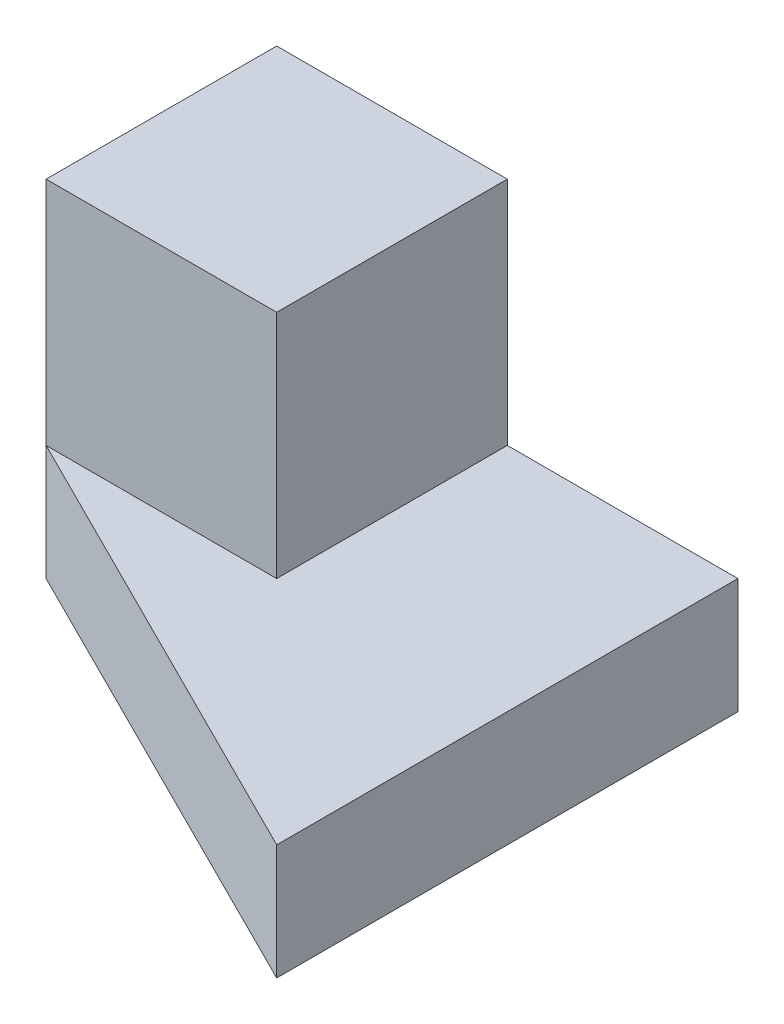
ISO-10303-21;
HEADER;
FILE_DESCRIPTION(('STEP AP214'),'2;1');
FILE_NAME('part.step','',(''),(''),'','','');
FILE_SCHEMA(('AUTOMOTIVE_DESIGN { 1 0 10303 214 1 1 1 1 }'));
ENDSEC;
DATA;
#1=APPLICATION_CONTEXT('core data for automotive mechanical design processes');
#2=APPLICATION_PROTOCOL_DEFINITION('international standard','automotive_design',2000,#1);
#3=PRODUCT_CONTEXT('',#1,'mechanical');
#4=PRODUCT('Part','Part','',(#3));
#5=PRODUCT_RELATED_PRODUCT_CATEGORY('part','',(#4));
#6=PRODUCT_DEFINITION_FORMATION('','',#4);
#7=PRODUCT_DEFINITION_CONTEXT('part definition',#1,'design');
#8=PRODUCT_DEFINITION('design','',#6,#7);
#9=PRODUCT_DEFINITION_SHAPE('','',#8);
#10=(LENGTH_UNIT() NAMED_UNIT(*) SI_UNIT(.MILLI.,.METRE.));
#11=(NAMED_UNIT(*) PLANE_ANGLE_UNIT() SI_UNIT($,.RADIAN.));
#12=(NAMED_UNIT(*) SI_UNIT($,.STERADIAN.) SOLID_ANGLE_UNIT());
#13=UNCERTAINTY_MEASURE_WITH_UNIT(LENGTH_MEASURE(1.E-05),#10,'distance_accuracy_value','');
#14=(GEOMETRIC_REPRESENTATION_CONTEXT(3) GLOBAL_UNCERTAINTY_ASSIGNED_CONTEXT((#13)) GLOBAL_UNIT_ASSIGNED_CONTEXT((#10,
#11,#12)) REPRESENTATION_CONTEXT('',''));
#15=CARTESIAN_POINT('',(0.,0.,0.));
#16=DIRECTION('',(0.,0.,1.));
#17=DIRECTION('',(1.,0.,0.));
#18=AXIS2_PLACEMENT_3D('',#15,#16,#17);
#19=CARTESIAN_POINT('',(0.,-10.,0.));
#20=DIRECTION('',(1.,0.,0.));
#21=DIRECTION('',(0.,0.,-1.));
#22=AXIS2_PLACEMENT_3D('',#19,#20,#21);
#23=PLANE('',#22);
#24=DIRECTION('',(0.,1.,0.));
#25=VECTOR('',#24,1.);
#26=CARTESIAN_POINT('',(0.,-10.,0.));
#27=LINE('',#26,#25);
#28=CARTESIAN_POINT('',(0.,-10.,0.));
#29=VERTEX_POINT('',#28);
#30=CARTESIAN_POINT('',(0.,0.,0.));
#31=VERTEX_POINT('',#30);
#32=EDGE_CURVE('E36',#29,#31,#27,.T.);
#33=ORIENTED_EDGE('',*,*,#32,.T.);
#34=DIRECTION('',(0.,-1.,0.));
#35=VECTOR('',#34,1.);
#36=CARTESIAN_POINT('',(0.,20.,0.));
#37=LINE('',#36,#35);
#38=CARTESIAN_POINT('',(0.,20.,0.));
#39=VERTEX_POINT('',#38);
#40=EDGE_CURVE('E123',#39,#31,#37,.T.);
#41=ORIENTED_EDGE('',*,*,#40,.F.);
#42=DIRECTION('',(0.,0.,-1.));
#43=VECTOR('',#42,1.);
#44=CARTESIAN_POINT('',(0.,20.,0.));
#45=LINE('',#44,#43);
#46=CARTESIAN_POINT('',(0.,20.,-20.));
#47=VERTEX_POINT('',#46);
#48=EDGE_CURVE('E112',#39,#47,#45,.T.);
#49=ORIENTED_EDGE('',*,*,#48,.T.);
#50=DIRECTION('',(0.,1.,0.));
#51=VECTOR('',#50,1.);
#52=CARTESIAN_POINT('',(0.,-10.,-20.));
#53=LINE('',#52,#51);
#54=CARTESIAN_POINT('',(0.,-10.,-20.));
#55=VERTEX_POINT('',#54);
#56=EDGE_CURVE('E11',#55,#47,#53,.T.);
#57=ORIENTED_EDGE('',*,*,#56,.F.);
#58=DIRECTION('',(0.,0.,-1.));
#59=VECTOR('',#58,1.);
#60=CARTESIAN_POINT('',(0.,-10.,0.));
#61=LINE('',#60,#59);
#62=EDGE_CURVE('E127',#29,#55,#61,.T.);
#63=ORIENTED_EDGE('',*,*,#62,.F.);
#64=EDGE_LOOP('',(#33,#41,#49,#57,#63));
#65=FACE_BOUND('',#64,.T.);
#66=ADVANCED_FACE('F33',(#65),#23,.F.);
#67=CARTESIAN_POINT('',(0.,-10.,-20.));
#68=DIRECTION('',(0.,0.,1.));
#69=DIRECTION('',(1.,0.,0.));
#70=AXIS2_PLACEMENT_3D('',#67,#68,#69);
#71=PLANE('',#70);
#72=ORIENTED_EDGE('',*,*,#56,.T.);
#73=DIRECTION('',(1.,0.,0.));
#74=VECTOR('',#73,1.);
#75=CARTESIAN_POINT('',(0.,20.,-20.));
#76=LINE('',#75,#74);
#77=CARTESIAN_POINT('',(20.,20.,-20.));
#78=VERTEX_POINT('',#77);
#79=EDGE_CURVE('E105',#47,#78,#76,.T.);
#80=ORIENTED_EDGE('',*,*,#79,.T.);
#81=DIRECTION('',(0.,-1.,0.));
#82=VECTOR('',#81,1.);
#83=CARTESIAN_POINT('',(20.,20.,-20.));
#84=LINE('',#83,#82);
#85=CARTESIAN_POINT('',(20.,0.,-20.));
#86=VERTEX_POINT('',#85);
#87=EDGE_CURVE('E101',#78,#86,#84,.T.);
#88=ORIENTED_EDGE('',*,*,#87,.T.);
#89=DIRECTION('',(1.,0.,0.));
#90=VECTOR('',#89,1.);
#91=CARTESIAN_POINT('',(0.,0.,-20.));
#92=LINE('',#91,#90);
#93=CARTESIAN_POINT('',(40.,0.,-20.));
#94=VERTEX_POINT('',#93);
#95=EDGE_CURVE('E72',#86,#94,#92,.T.);
#96=ORIENTED_EDGE('',*,*,#95,.T.);
#97=DIRECTION('',(0.,1.,0.));
#98=VECTOR('',#97,1.);
#99=CARTESIAN_POINT('',(40.,-10.,-20.));
#100=LINE('',#99,#98);
#101=CARTESIAN_POINT('',(40.,-10.,-20.));
#102=VERTEX_POINT('',#101);
#103=EDGE_CURVE('E41',#102,#94,#100,.T.);
#104=ORIENTED_EDGE('',*,*,#103,.F.);
#105=DIRECTION('',(1.,0.,0.));
#106=VECTOR('',#105,1.);
#107=CARTESIAN_POINT('',(0.,-10.,-20.));
#108=LINE('',#107,#106);
#109=EDGE_CURVE('E57',#55,#102,#108,.T.);
#110=ORIENTED_EDGE('',*,*,#109,.F.);
#111=EDGE_LOOP('',(#72,#80,#88,#96,#104,#110));
#112=FACE_BOUND('',#111,.T.);
#113=ADVANCED_FACE('F148',(#112),#71,.F.);
#114=CARTESIAN_POINT('',(40.,-10.,0.));
#115=DIRECTION('',(-1.,0.,0.));
#116=DIRECTION('',(0.,0.,1.));
#117=AXIS2_PLACEMENT_3D('',#114,#115,#116);
#118=PLANE('',#117);
#119=DIRECTION('',(0.,0.,1.));
#120=VECTOR('',#119,1.);
#121=CARTESIAN_POINT('',(40.,0.,0.));
#122=LINE('',#121,#120);
#123=CARTESIAN_POINT('',(40.,0.,20.));
#124=VERTEX_POINT('',#123);
#125=EDGE_CURVE('E121',#94,#124,#122,.T.);
#126=ORIENTED_EDGE('',*,*,#125,.T.);
#127=DIRECTION('',(0.,1.,0.));
#128=VECTOR('',#127,1.);
#129=CARTESIAN_POINT('',(40.,-10.,20.));
#130=LINE('',#129,#128);
#131=CARTESIAN_POINT('',(40.,-10.,20.));
#132=VERTEX_POINT('',#131);
#133=EDGE_CURVE('E135',#132,#124,#130,.T.);
#134=ORIENTED_EDGE('',*,*,#133,.F.);
#135=DIRECTION('',(0.,0.,1.));
#136=VECTOR('',#135,1.);
#137=CARTESIAN_POINT('',(40.,-10.,0.));
#138=LINE('',#137,#136);
#139=EDGE_CURVE('E130',#102,#132,#138,.T.);
#140=ORIENTED_EDGE('',*,*,#139,.F.);
#141=ORIENTED_EDGE('',*,*,#103,.T.);
#142=EDGE_LOOP('',(#126,#134,#140,#141));
#143=FACE_BOUND('',#142,.T.);
#144=ADVANCED_FACE('F150',(#143),#118,.F.);
#145=CARTESIAN_POINT('',(0.,-10.,0.));
#146=DIRECTION('',(0.447213595499958,0.,-0.894427190999916));
#147=DIRECTION('',(-0.894427190999916,0.,-0.447213595499958));
#148=AXIS2_PLACEMENT_3D('',#145,#146,#147);
#149=PLANE('',#148);
#150=DIRECTION('',(-0.894427190999916,0.,-0.447213595499958));
#151=VECTOR('',#150,1.);
#152=CARTESIAN_POINT('',(0.,0.,0.));
#153=LINE('',#152,#151);
#154=EDGE_CURVE('E118',#124,#31,#153,.T.);
#155=ORIENTED_EDGE('',*,*,#154,.T.);
#156=ORIENTED_EDGE('',*,*,#32,.F.);
#157=DIRECTION('',(-0.894427190999916,0.,-0.447213595499958));
#158=VECTOR('',#157,1.);
#159=CARTESIAN_POINT('',(0.,-10.,0.));
#160=LINE('',#159,#158);
#161=EDGE_CURVE('E79',#132,#29,#160,.T.);
#162=ORIENTED_EDGE('',*,*,#161,.F.);
#163=ORIENTED_EDGE('',*,*,#133,.T.);
#164=EDGE_LOOP('',(#155,#156,#162,#163));
#165=FACE_BOUND('',#164,.T.);
#166=ADVANCED_FACE('F156',(#165),#149,.F.);
#167=CARTESIAN_POINT('',(0.,-10.,0.));
#168=DIRECTION('',(0.,1.,0.));
#169=DIRECTION('',(0.,0.,1.));
#170=AXIS2_PLACEMENT_3D('',#167,#168,#169);
#171=PLANE('',#170);
#172=ORIENTED_EDGE('',*,*,#62,.T.);
#173=ORIENTED_EDGE('',*,*,#109,.T.);
#174=ORIENTED_EDGE('',*,*,#139,.T.);
#175=ORIENTED_EDGE('',*,*,#161,.T.);
#176=EDGE_LOOP('',(#172,#173,#174,#175));
#177=FACE_BOUND('',#176,.T.);
#178=ADVANCED_FACE('F163',(#177),#171,.F.);
#179=CARTESIAN_POINT('',(0.,0.,0.));
#180=DIRECTION('',(0.,1.,0.));
#181=DIRECTION('',(0.,0.,1.));
#182=AXIS2_PLACEMENT_3D('',#179,#180,#181);
#183=PLANE('',#182);
#184=DIRECTION('',(1.,0.,0.));
#185=VECTOR('',#184,1.);
#186=CARTESIAN_POINT('',(0.,0.,0.));
#187=LINE('',#186,#185);
#188=CARTESIAN_POINT('',(20.,0.,0.));
#189=VERTEX_POINT('',#188);
#190=EDGE_CURVE('E117',#31,#189,#187,.T.);
#191=ORIENTED_EDGE('',*,*,#190,.F.);
#192=ORIENTED_EDGE('',*,*,#154,.F.);
#193=ORIENTED_EDGE('',*,*,#125,.F.);
#194=ORIENTED_EDGE('',*,*,#95,.F.);
#195=DIRECTION('',(0.,0.,-1.));
#196=VECTOR('',#195,1.);
#197=CARTESIAN_POINT('',(20.,0.,0.));
#198=LINE('',#197,#196);
#199=EDGE_CURVE('E49',#189,#86,#198,.T.);
#200=ORIENTED_EDGE('',*,*,#199,.F.);
#201=EDGE_LOOP('',(#191,#192,#193,#194,#200));
#202=FACE_BOUND('',#201,.T.);
#203=ADVANCED_FACE('F160',(#202),#183,.T.);
#204=CARTESIAN_POINT('',(0.,20.,0.));
#205=DIRECTION('',(0.,0.,-1.));
#206=DIRECTION('',(-1.,0.,0.));
#207=AXIS2_PLACEMENT_3D('',#204,#205,#206);
#208=PLANE('',#207);
#209=ORIENTED_EDGE('',*,*,#190,.T.);
#210=DIRECTION('',(0.,-1.,0.));
#211=VECTOR('',#210,1.);
#212=CARTESIAN_POINT('',(20.,20.,0.));
#213=LINE('',#212,#211);
#214=CARTESIAN_POINT('',(20.,20.,0.));
#215=VERTEX_POINT('',#214);
#216=EDGE_CURVE('E99',#215,#189,#213,.T.);
#217=ORIENTED_EDGE('',*,*,#216,.F.);
#218=DIRECTION('',(1.,0.,0.));
#219=VECTOR('',#218,1.);
#220=CARTESIAN_POINT('',(0.,20.,0.));
#221=LINE('',#220,#219);
#222=EDGE_CURVE('E106',#39,#215,#221,.T.);
#223=ORIENTED_EDGE('',*,*,#222,.F.);
#224=ORIENTED_EDGE('',*,*,#40,.T.);
#225=EDGE_LOOP('',(#209,#217,#223,#224));
#226=FACE_BOUND('',#225,.T.);
#227=ADVANCED_FACE('F116',(#226),#208,.F.);
#228=CARTESIAN_POINT('',(20.,20.,0.));
#229=DIRECTION('',(-1.,0.,0.));
#230=DIRECTION('',(0.,0.,1.));
#231=AXIS2_PLACEMENT_3D('',#228,#229,#230);
#232=PLANE('',#231);
#233=ORIENTED_EDGE('',*,*,#199,.T.);
#234=ORIENTED_EDGE('',*,*,#87,.F.);
#235=DIRECTION('',(0.,0.,-1.));
#236=VECTOR('',#235,1.);
#237=CARTESIAN_POINT('',(20.,20.,0.));
#238=LINE('',#237,#236);
#239=EDGE_CURVE('E95',#215,#78,#238,.T.);
#240=ORIENTED_EDGE('',*,*,#239,.F.);
#241=ORIENTED_EDGE('',*,*,#216,.T.);
#242=EDGE_LOOP('',(#233,#234,#240,#241));
#243=FACE_BOUND('',#242,.T.);
#244=ADVANCED_FACE('F97',(#243),#232,.F.);
#245=CARTESIAN_POINT('',(0.,20.,0.));
#246=DIRECTION('',(0.,1.,0.));
#247=DIRECTION('',(0.,0.,1.));
#248=AXIS2_PLACEMENT_3D('',#245,#246,#247);
#249=PLANE('',#248);
#250=ORIENTED_EDGE('',*,*,#222,.T.);
#251=ORIENTED_EDGE('',*,*,#239,.T.);
#252=ORIENTED_EDGE('',*,*,#79,.F.);
#253=ORIENTED_EDGE('',*,*,#48,.F.);
#254=EDGE_LOOP('',(#250,#251,#252,#253));
#255=FACE_BOUND('',#254,.T.);
#256=ADVANCED_FACE('F110',(#255),#249,.T.);
#257=CLOSED_SHELL('',(#66,#113,#144,#166,#178,#203,#227,#244,#256));
#258=MANIFOLD_SOLID_BREP('B2',#257);
#259=ADVANCED_BREP_SHAPE_REPRESENTATION('',(#18,#258),#14);
#260=SHAPE_DEFINITION_REPRESENTATION(#9,#259);
ENDSEC;
END-ISO-10303-21;
